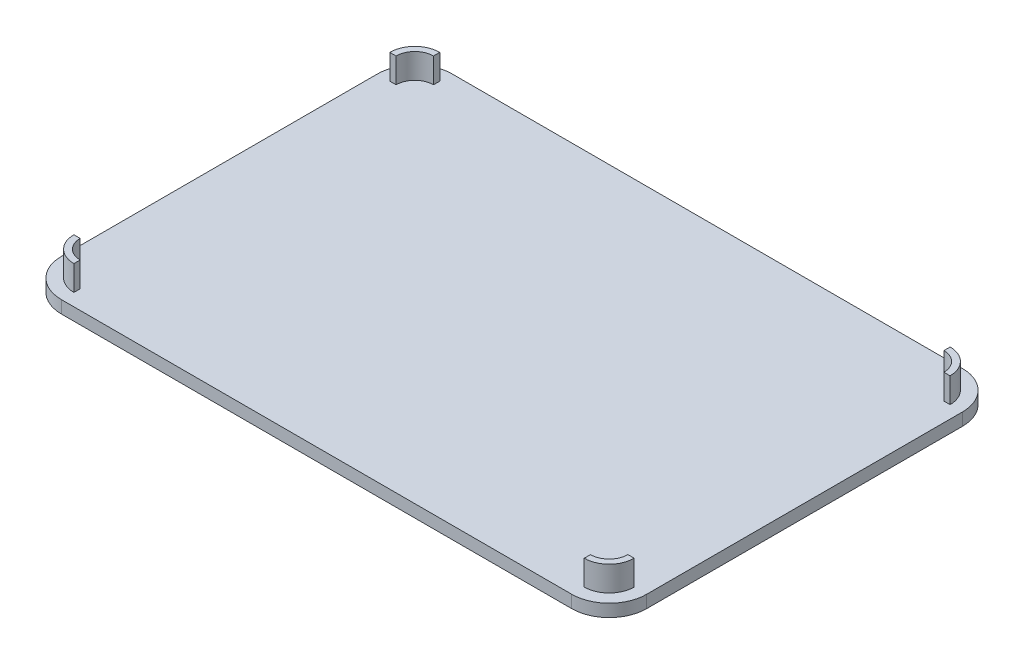
ISO-10303-21;
HEADER;
FILE_DESCRIPTION(('STEP AP214'),'2;1');
FILE_NAME('part.step','',(''),(''),'','','');
FILE_SCHEMA(('AUTOMOTIVE_DESIGN { 1 0 10303 214 1 1 1 1 }'));
ENDSEC;
DATA;
#1=APPLICATION_CONTEXT('core data for automotive mechanical design processes');
#2=APPLICATION_PROTOCOL_DEFINITION('international standard','automotive_design',2000,#1);
#3=PRODUCT_CONTEXT('',#1,'mechanical');
#4=PRODUCT('Part','Part','',(#3));
#5=PRODUCT_RELATED_PRODUCT_CATEGORY('part','',(#4));
#6=PRODUCT_DEFINITION_FORMATION('','',#4);
#7=PRODUCT_DEFINITION_CONTEXT('part definition',#1,'design');
#8=PRODUCT_DEFINITION('design','',#6,#7);
#9=PRODUCT_DEFINITION_SHAPE('','',#8);
#10=(LENGTH_UNIT() NAMED_UNIT(*) SI_UNIT(.MILLI.,.METRE.));
#11=(NAMED_UNIT(*) PLANE_ANGLE_UNIT() SI_UNIT($,.RADIAN.));
#12=(NAMED_UNIT(*) SI_UNIT($,.STERADIAN.) SOLID_ANGLE_UNIT());
#13=UNCERTAINTY_MEASURE_WITH_UNIT(LENGTH_MEASURE(1.E-05),#10,'distance_accuracy_value','');
#14=(GEOMETRIC_REPRESENTATION_CONTEXT(3) GLOBAL_UNCERTAINTY_ASSIGNED_CONTEXT((#13)) GLOBAL_UNIT_ASSIGNED_CONTEXT((#10,
#11,#12)) REPRESENTATION_CONTEXT('',''));
#15=CARTESIAN_POINT('',(0.,0.,0.));
#16=DIRECTION('',(0.,0.,1.));
#17=DIRECTION('',(1.,0.,0.));
#18=AXIS2_PLACEMENT_3D('',#15,#16,#17);
#19=CARTESIAN_POINT('',(40.87,2.,25.3));
#20=DIRECTION('',(0.,-1.,0.));
#21=DIRECTION('',(0.,0.,-1.));
#22=AXIS2_PLACEMENT_3D('',#19,#20,#21);
#23=CYLINDRICAL_SURFACE('',#22,6.);
#24=CARTESIAN_POINT('',(40.87,0.,25.3));
#25=DIRECTION('',(0.,1.,0.));
#26=DIRECTION('',(0.,0.,1.));
#27=AXIS2_PLACEMENT_3D('',#24,#25,#26);
#28=CIRCLE('',#27,6.);
#29=CARTESIAN_POINT('',(40.87,0.,31.3));
#30=VERTEX_POINT('',#29);
#31=CARTESIAN_POINT('',(46.87,0.,25.3));
#32=VERTEX_POINT('',#31);
#33=EDGE_CURVE('E318',#30,#32,#28,.T.);
#34=ORIENTED_EDGE('',*,*,#33,.T.);
#35=DIRECTION('',(0.,-1.,0.));
#36=VECTOR('',#35,1.);
#37=CARTESIAN_POINT('',(46.87,2.,25.3));
#38=LINE('',#37,#36);
#39=CARTESIAN_POINT('',(46.87,2.,25.3));
#40=VERTEX_POINT('',#39);
#41=EDGE_CURVE('E11',#40,#32,#38,.T.);
#42=ORIENTED_EDGE('',*,*,#41,.F.);
#43=CARTESIAN_POINT('',(40.87,2.,25.3));
#44=DIRECTION('',(0.,1.,0.));
#45=DIRECTION('',(0.,0.,1.));
#46=AXIS2_PLACEMENT_3D('',#43,#44,#45);
#47=CIRCLE('',#46,6.);
#48=CARTESIAN_POINT('',(40.87,2.,31.3));
#49=VERTEX_POINT('',#48);
#50=EDGE_CURVE('E319',#49,#40,#47,.T.);
#51=ORIENTED_EDGE('',*,*,#50,.F.);
#52=DIRECTION('',(0.,-1.,0.));
#53=VECTOR('',#52,1.);
#54=CARTESIAN_POINT('',(40.87,2.,31.3));
#55=LINE('',#54,#53);
#56=EDGE_CURVE('E337',#49,#30,#55,.T.);
#57=ORIENTED_EDGE('',*,*,#56,.T.);
#58=EDGE_LOOP('',(#34,#42,#51,#57));
#59=FACE_BOUND('',#58,.T.);
#60=ADVANCED_FACE('F35',(#59),#23,.T.);
#61=CARTESIAN_POINT('',(46.87,2.,25.3));
#62=DIRECTION('',(-1.,0.,0.));
#63=DIRECTION('',(0.,0.,1.));
#64=AXIS2_PLACEMENT_3D('',#61,#62,#63);
#65=PLANE('',#64);
#66=DIRECTION('',(0.,0.,-1.));
#67=VECTOR('',#66,1.);
#68=CARTESIAN_POINT('',(46.87,0.,25.3));
#69=LINE('',#68,#67);
#70=CARTESIAN_POINT('',(46.87,0.,-25.3));
#71=VERTEX_POINT('',#70);
#72=EDGE_CURVE('E340',#32,#71,#69,.T.);
#73=ORIENTED_EDGE('',*,*,#72,.T.);
#74=DIRECTION('',(0.,-1.,0.));
#75=VECTOR('',#74,1.);
#76=CARTESIAN_POINT('',(46.87,2.,-25.3));
#77=LINE('',#76,#75);
#78=CARTESIAN_POINT('',(46.87,2.,-25.3));
#79=VERTEX_POINT('',#78);
#80=EDGE_CURVE('E42',#79,#71,#77,.T.);
#81=ORIENTED_EDGE('',*,*,#80,.F.);
#82=DIRECTION('',(0.,0.,-1.));
#83=VECTOR('',#82,1.);
#84=CARTESIAN_POINT('',(46.87,2.,25.3));
#85=LINE('',#84,#83);
#86=EDGE_CURVE('E322',#40,#79,#85,.T.);
#87=ORIENTED_EDGE('',*,*,#86,.F.);
#88=ORIENTED_EDGE('',*,*,#41,.T.);
#89=EDGE_LOOP('',(#73,#81,#87,#88));
#90=FACE_BOUND('',#89,.T.);
#91=ADVANCED_FACE('F396',(#90),#65,.F.);
#92=CARTESIAN_POINT('',(40.87,2.,-25.3));
#93=DIRECTION('',(0.,-1.,0.));
#94=DIRECTION('',(0.,0.,-1.));
#95=AXIS2_PLACEMENT_3D('',#92,#93,#94);
#96=CYLINDRICAL_SURFACE('',#95,6.);
#97=CARTESIAN_POINT('',(40.87,0.,-25.3));
#98=DIRECTION('',(0.,1.,0.));
#99=DIRECTION('',(0.,0.,-1.));
#100=AXIS2_PLACEMENT_3D('',#97,#98,#99);
#101=CIRCLE('',#100,6.);
#102=CARTESIAN_POINT('',(40.87,0.,-31.3));
#103=VERTEX_POINT('',#102);
#104=EDGE_CURVE('E342',#71,#103,#101,.T.);
#105=ORIENTED_EDGE('',*,*,#104,.T.);
#106=DIRECTION('',(0.,-1.,0.));
#107=VECTOR('',#106,1.);
#108=CARTESIAN_POINT('',(40.87,2.,-31.3));
#109=LINE('',#108,#107);
#110=CARTESIAN_POINT('',(40.87,2.,-31.3));
#111=VERTEX_POINT('',#110);
#112=EDGE_CURVE('E367',#111,#103,#109,.T.);
#113=ORIENTED_EDGE('',*,*,#112,.F.);
#114=CARTESIAN_POINT('',(40.87,2.,-25.3));
#115=DIRECTION('',(0.,1.,0.));
#116=DIRECTION('',(0.,0.,-1.));
#117=AXIS2_PLACEMENT_3D('',#114,#115,#116);
#118=CIRCLE('',#117,6.);
#119=EDGE_CURVE('E325',#79,#111,#118,.T.);
#120=ORIENTED_EDGE('',*,*,#119,.F.);
#121=ORIENTED_EDGE('',*,*,#80,.T.);
#122=EDGE_LOOP('',(#105,#113,#120,#121));
#123=FACE_BOUND('',#122,.T.);
#124=ADVANCED_FACE('F374',(#123),#96,.T.);
#125=CARTESIAN_POINT('',(-40.8699999999999,2.,-31.3));
#126=DIRECTION('',(0.,0.,1.));
#127=DIRECTION('',(1.,0.,0.));
#128=AXIS2_PLACEMENT_3D('',#125,#126,#127);
#129=PLANE('',#128);
#130=DIRECTION('',(-1.,0.,0.));
#131=VECTOR('',#130,1.);
#132=CARTESIAN_POINT('',(-40.8699999999999,0.,-31.3));
#133=LINE('',#132,#131);
#134=CARTESIAN_POINT('',(-40.87,0.,-31.3));
#135=VERTEX_POINT('',#134);
#136=EDGE_CURVE('E344',#103,#135,#133,.T.);
#137=ORIENTED_EDGE('',*,*,#136,.T.);
#138=DIRECTION('',(0.,-1.,0.));
#139=VECTOR('',#138,1.);
#140=CARTESIAN_POINT('',(-40.87,2.,-31.3));
#141=LINE('',#140,#139);
#142=CARTESIAN_POINT('',(-40.87,2.,-31.3));
#143=VERTEX_POINT('',#142);
#144=EDGE_CURVE('E364',#143,#135,#141,.T.);
#145=ORIENTED_EDGE('',*,*,#144,.F.);
#146=DIRECTION('',(-1.,0.,0.));
#147=VECTOR('',#146,1.);
#148=CARTESIAN_POINT('',(-40.8699999999999,2.,-31.3));
#149=LINE('',#148,#147);
#150=EDGE_CURVE('E327',#111,#143,#149,.T.);
#151=ORIENTED_EDGE('',*,*,#150,.F.);
#152=ORIENTED_EDGE('',*,*,#112,.T.);
#153=EDGE_LOOP('',(#137,#145,#151,#152));
#154=FACE_BOUND('',#153,.T.);
#155=ADVANCED_FACE('F385',(#154),#129,.F.);
#156=CARTESIAN_POINT('',(-40.87,2.,-25.3));
#157=DIRECTION('',(0.,-1.,0.));
#158=DIRECTION('',(0.,0.,-1.));
#159=AXIS2_PLACEMENT_3D('',#156,#157,#158);
#160=CYLINDRICAL_SURFACE('',#159,6.);
#161=CARTESIAN_POINT('',(-40.87,0.,-25.3));
#162=DIRECTION('',(0.,1.,0.));
#163=DIRECTION('',(0.,0.,-1.));
#164=AXIS2_PLACEMENT_3D('',#161,#162,#163);
#165=CIRCLE('',#164,6.);
#166=CARTESIAN_POINT('',(-46.87,0.,-25.3));
#167=VERTEX_POINT('',#166);
#168=EDGE_CURVE('E346',#135,#167,#165,.T.);
#169=ORIENTED_EDGE('',*,*,#168,.T.);
#170=DIRECTION('',(0.,-1.,0.));
#171=VECTOR('',#170,1.);
#172=CARTESIAN_POINT('',(-46.87,2.,-25.3));
#173=LINE('',#172,#171);
#174=CARTESIAN_POINT('',(-46.87,2.,-25.3));
#175=VERTEX_POINT('',#174);
#176=EDGE_CURVE('E361',#175,#167,#173,.T.);
#177=ORIENTED_EDGE('',*,*,#176,.F.);
#178=CARTESIAN_POINT('',(-40.87,2.,-25.3));
#179=DIRECTION('',(0.,1.,0.));
#180=DIRECTION('',(0.,0.,-1.));
#181=AXIS2_PLACEMENT_3D('',#178,#179,#180);
#182=CIRCLE('',#181,6.);
#183=EDGE_CURVE('E329',#143,#175,#182,.T.);
#184=ORIENTED_EDGE('',*,*,#183,.F.);
#185=ORIENTED_EDGE('',*,*,#144,.T.);
#186=EDGE_LOOP('',(#169,#177,#184,#185));
#187=FACE_BOUND('',#186,.T.);
#188=ADVANCED_FACE('F389',(#187),#160,.T.);
#189=CARTESIAN_POINT('',(-46.87,2.,25.3));
#190=DIRECTION('',(1.,0.,0.));
#191=DIRECTION('',(0.,0.,-1.));
#192=AXIS2_PLACEMENT_3D('',#189,#190,#191);
#193=PLANE('',#192);
#194=DIRECTION('',(0.,0.,1.));
#195=VECTOR('',#194,1.);
#196=CARTESIAN_POINT('',(-46.87,0.,25.3));
#197=LINE('',#196,#195);
#198=CARTESIAN_POINT('',(-46.87,0.,25.3));
#199=VERTEX_POINT('',#198);
#200=EDGE_CURVE('E348',#167,#199,#197,.T.);
#201=ORIENTED_EDGE('',*,*,#200,.T.);
#202=DIRECTION('',(0.,-1.,0.));
#203=VECTOR('',#202,1.);
#204=CARTESIAN_POINT('',(-46.87,2.,25.3));
#205=LINE('',#204,#203);
#206=CARTESIAN_POINT('',(-46.87,2.,25.3));
#207=VERTEX_POINT('',#206);
#208=EDGE_CURVE('E358',#207,#199,#205,.T.);
#209=ORIENTED_EDGE('',*,*,#208,.F.);
#210=DIRECTION('',(0.,0.,1.));
#211=VECTOR('',#210,1.);
#212=CARTESIAN_POINT('',(-46.87,2.,25.3));
#213=LINE('',#212,#211);
#214=EDGE_CURVE('E331',#175,#207,#213,.T.);
#215=ORIENTED_EDGE('',*,*,#214,.F.);
#216=ORIENTED_EDGE('',*,*,#176,.T.);
#217=EDGE_LOOP('',(#201,#209,#215,#216));
#218=FACE_BOUND('',#217,.T.);
#219=ADVANCED_FACE('F409',(#218),#193,.F.);
#220=CARTESIAN_POINT('',(-40.87,2.,25.3));
#221=DIRECTION('',(0.,-1.,0.));
#222=DIRECTION('',(0.,0.,-1.));
#223=AXIS2_PLACEMENT_3D('',#220,#221,#222);
#224=CYLINDRICAL_SURFACE('',#223,6.);
#225=CARTESIAN_POINT('',(-40.87,0.,25.3));
#226=DIRECTION('',(0.,1.,0.));
#227=DIRECTION('',(0.,0.,-1.));
#228=AXIS2_PLACEMENT_3D('',#225,#226,#227);
#229=CIRCLE('',#228,6.);
#230=CARTESIAN_POINT('',(-40.8699999999999,0.,31.3));
#231=VERTEX_POINT('',#230);
#232=EDGE_CURVE('E350',#199,#231,#229,.T.);
#233=ORIENTED_EDGE('',*,*,#232,.T.);
#234=DIRECTION('',(0.,-1.,0.));
#235=VECTOR('',#234,1.);
#236=CARTESIAN_POINT('',(-40.8699999999999,2.,31.3));
#237=LINE('',#236,#235);
#238=CARTESIAN_POINT('',(-40.8699999999999,2.,31.3));
#239=VERTEX_POINT('',#238);
#240=EDGE_CURVE('E355',#239,#231,#237,.T.);
#241=ORIENTED_EDGE('',*,*,#240,.F.);
#242=CARTESIAN_POINT('',(-40.87,2.,25.3));
#243=DIRECTION('',(0.,1.,0.));
#244=DIRECTION('',(0.,0.,-1.));
#245=AXIS2_PLACEMENT_3D('',#242,#243,#244);
#246=CIRCLE('',#245,6.);
#247=EDGE_CURVE('E333',#207,#239,#246,.T.);
#248=ORIENTED_EDGE('',*,*,#247,.F.);
#249=ORIENTED_EDGE('',*,*,#208,.T.);
#250=EDGE_LOOP('',(#233,#241,#248,#249));
#251=FACE_BOUND('',#250,.T.);
#252=ADVANCED_FACE('F407',(#251),#224,.T.);
#253=CARTESIAN_POINT('',(-40.8699999999999,2.,31.3));
#254=DIRECTION('',(0.,0.,-1.));
#255=DIRECTION('',(-1.,0.,0.));
#256=AXIS2_PLACEMENT_3D('',#253,#254,#255);
#257=PLANE('',#256);
#258=DIRECTION('',(1.,0.,0.));
#259=VECTOR('',#258,1.);
#260=CARTESIAN_POINT('',(-40.8699999999999,0.,31.3));
#261=LINE('',#260,#259);
#262=EDGE_CURVE('E323',#231,#30,#261,.T.);
#263=ORIENTED_EDGE('',*,*,#262,.T.);
#264=ORIENTED_EDGE('',*,*,#56,.F.);
#265=DIRECTION('',(1.,0.,0.));
#266=VECTOR('',#265,1.);
#267=CARTESIAN_POINT('',(-40.8699999999999,2.,31.3));
#268=LINE('',#267,#266);
#269=EDGE_CURVE('E335',#239,#49,#268,.T.);
#270=ORIENTED_EDGE('',*,*,#269,.F.);
#271=ORIENTED_EDGE('',*,*,#240,.T.);
#272=EDGE_LOOP('',(#263,#264,#270,#271));
#273=FACE_BOUND('',#272,.T.);
#274=ADVANCED_FACE('F402',(#273),#257,.F.);
#275=CARTESIAN_POINT('',(40.87,2.,25.3));
#276=DIRECTION('',(0.,1.,0.));
#277=DIRECTION('',(0.,0.,1.));
#278=AXIS2_PLACEMENT_3D('',#275,#276,#277);
#279=PLANE('',#278);
#280=DIRECTION('',(1.,0.,0.));
#281=VECTOR('',#280,1.);
#282=CARTESIAN_POINT('',(43.87,2.,25.3));
#283=LINE('',#282,#281);
#284=CARTESIAN_POINT('',(43.87,2.,25.3));
#285=VERTEX_POINT('',#284);
#286=CARTESIAN_POINT('',(44.87,2.,25.3));
#287=VERTEX_POINT('',#286);
#288=EDGE_CURVE('E192',#285,#287,#283,.T.);
#289=ORIENTED_EDGE('',*,*,#288,.T.);
#290=CARTESIAN_POINT('',(40.87,2.,25.3));
#291=DIRECTION('',(0.,-1.,0.));
#292=DIRECTION('',(0.,0.,-1.));
#293=AXIS2_PLACEMENT_3D('',#290,#291,#292);
#294=CIRCLE('',#293,4.);
#295=CARTESIAN_POINT('',(40.87,2.,29.3));
#296=VERTEX_POINT('',#295);
#297=EDGE_CURVE('E197',#287,#296,#294,.T.);
#298=ORIENTED_EDGE('',*,*,#297,.T.);
#299=DIRECTION('',(0.,0.,-1.));
#300=VECTOR('',#299,1.);
#301=CARTESIAN_POINT('',(40.87,2.,29.3));
#302=LINE('',#301,#300);
#303=CARTESIAN_POINT('',(40.87,2.,28.3));
#304=VERTEX_POINT('',#303);
#305=EDGE_CURVE('E54',#296,#304,#302,.T.);
#306=ORIENTED_EDGE('',*,*,#305,.T.);
#307=CARTESIAN_POINT('',(40.87,2.,25.3));
#308=DIRECTION('',(0.,-1.,0.));
#309=DIRECTION('',(0.,0.,-1.));
#310=AXIS2_PLACEMENT_3D('',#307,#308,#309);
#311=CIRCLE('',#310,3.);
#312=EDGE_CURVE('E49',#285,#304,#311,.T.);
#313=ORIENTED_EDGE('',*,*,#312,.F.);
#314=EDGE_LOOP('',(#289,#298,#306,#313));
#315=FACE_BOUND('',#314,.T.);
#316=CARTESIAN_POINT('',(-40.87,2.,25.3));
#317=DIRECTION('',(0.,1.,0.));
#318=DIRECTION('',(0.,0.,1.));
#319=AXIS2_PLACEMENT_3D('',#316,#317,#318);
#320=CIRCLE('',#319,4.);
#321=CARTESIAN_POINT('',(-44.87,2.,25.3));
#322=VERTEX_POINT('',#321);
#323=CARTESIAN_POINT('',(-40.87,2.,29.3));
#324=VERTEX_POINT('',#323);
#325=EDGE_CURVE('E243',#322,#324,#320,.T.);
#326=ORIENTED_EDGE('',*,*,#325,.F.);
#327=DIRECTION('',(-1.,0.,0.));
#328=VECTOR('',#327,1.);
#329=CARTESIAN_POINT('',(-43.87,2.,25.3));
#330=LINE('',#329,#328);
#331=CARTESIAN_POINT('',(-43.87,2.,25.3));
#332=VERTEX_POINT('',#331);
#333=EDGE_CURVE('E246',#332,#322,#330,.T.);
#334=ORIENTED_EDGE('',*,*,#333,.F.);
#335=CARTESIAN_POINT('',(-40.87,2.,25.3));
#336=DIRECTION('',(0.,1.,0.));
#337=DIRECTION('',(0.,0.,1.));
#338=AXIS2_PLACEMENT_3D('',#335,#336,#337);
#339=CIRCLE('',#338,3.);
#340=CARTESIAN_POINT('',(-40.87,2.,28.3));
#341=VERTEX_POINT('',#340);
#342=EDGE_CURVE('E237',#332,#341,#339,.T.);
#343=ORIENTED_EDGE('',*,*,#342,.T.);
#344=DIRECTION('',(0.,0.,-1.));
#345=VECTOR('',#344,1.);
#346=CARTESIAN_POINT('',(-40.87,2.,29.3));
#347=LINE('',#346,#345);
#348=EDGE_CURVE('E239',#324,#341,#347,.T.);
#349=ORIENTED_EDGE('',*,*,#348,.F.);
#350=EDGE_LOOP('',(#326,#334,#343,#349));
#351=FACE_BOUND('',#350,.T.);
#352=CARTESIAN_POINT('',(-40.87,2.,-25.3));
#353=DIRECTION('',(0.,1.,0.));
#354=DIRECTION('',(0.,0.,1.));
#355=AXIS2_PLACEMENT_3D('',#352,#353,#354);
#356=CIRCLE('',#355,4.);
#357=CARTESIAN_POINT('',(-44.87,2.,-25.3));
#358=VERTEX_POINT('',#357);
#359=CARTESIAN_POINT('',(-40.87,2.,-29.3));
#360=VERTEX_POINT('',#359);
#361=EDGE_CURVE('E278',#358,#360,#356,.F.);
#362=ORIENTED_EDGE('',*,*,#361,.T.);
#363=DIRECTION('',(0.,0.,1.));
#364=VECTOR('',#363,1.);
#365=CARTESIAN_POINT('',(-40.87,2.,0.));
#366=LINE('',#365,#364);
#367=CARTESIAN_POINT('',(-40.87,2.,-28.3));
#368=VERTEX_POINT('',#367);
#369=EDGE_CURVE('E270',#360,#368,#366,.T.);
#370=ORIENTED_EDGE('',*,*,#369,.T.);
#371=CARTESIAN_POINT('',(-40.87,2.,-25.3));
#372=DIRECTION('',(0.,1.,0.));
#373=DIRECTION('',(0.,0.,1.));
#374=AXIS2_PLACEMENT_3D('',#371,#372,#373);
#375=CIRCLE('',#374,3.);
#376=CARTESIAN_POINT('',(-43.87,2.,-25.3));
#377=VERTEX_POINT('',#376);
#378=EDGE_CURVE('E272',#377,#368,#375,.F.);
#379=ORIENTED_EDGE('',*,*,#378,.F.);
#380=DIRECTION('',(-1.,0.,0.));
#381=VECTOR('',#380,1.);
#382=CARTESIAN_POINT('',(0.,2.,-25.3));
#383=LINE('',#382,#381);
#384=EDGE_CURVE('E276',#377,#358,#383,.T.);
#385=ORIENTED_EDGE('',*,*,#384,.T.);
#386=EDGE_LOOP('',(#362,#370,#379,#385));
#387=FACE_BOUND('',#386,.T.);
#388=CARTESIAN_POINT('',(40.87,2.,-25.3));
#389=DIRECTION('',(0.,1.,0.));
#390=DIRECTION('',(0.,0.,1.));
#391=AXIS2_PLACEMENT_3D('',#388,#389,#390);
#392=CIRCLE('',#391,3.);
#393=CARTESIAN_POINT('',(43.87,2.,-25.3));
#394=VERTEX_POINT('',#393);
#395=CARTESIAN_POINT('',(40.87,2.,-28.3));
#396=VERTEX_POINT('',#395);
#397=EDGE_CURVE('E280',#394,#396,#392,.T.);
#398=ORIENTED_EDGE('',*,*,#397,.T.);
#399=DIRECTION('',(0.,0.,1.));
#400=VECTOR('',#399,1.);
#401=CARTESIAN_POINT('',(40.87,2.,0.));
#402=LINE('',#401,#400);
#403=CARTESIAN_POINT('',(40.87,2.,-29.3));
#404=VERTEX_POINT('',#403);
#405=EDGE_CURVE('E294',#404,#396,#402,.T.);
#406=ORIENTED_EDGE('',*,*,#405,.F.);
#407=CARTESIAN_POINT('',(40.87,2.,-25.3));
#408=DIRECTION('',(0.,1.,0.));
#409=DIRECTION('',(0.,0.,1.));
#410=AXIS2_PLACEMENT_3D('',#407,#408,#409);
#411=CIRCLE('',#410,4.);
#412=CARTESIAN_POINT('',(44.87,2.,-25.3));
#413=VERTEX_POINT('',#412);
#414=EDGE_CURVE('E305',#413,#404,#411,.T.);
#415=ORIENTED_EDGE('',*,*,#414,.F.);
#416=DIRECTION('',(1.,0.,0.));
#417=VECTOR('',#416,1.);
#418=CARTESIAN_POINT('',(0.,2.,-25.3));
#419=LINE('',#418,#417);
#420=EDGE_CURVE('E303',#394,#413,#419,.T.);
#421=ORIENTED_EDGE('',*,*,#420,.F.);
#422=EDGE_LOOP('',(#398,#406,#415,#421));
#423=FACE_BOUND('',#422,.T.);
#424=ORIENTED_EDGE('',*,*,#50,.T.);
#425=ORIENTED_EDGE('',*,*,#86,.T.);
#426=ORIENTED_EDGE('',*,*,#119,.T.);
#427=ORIENTED_EDGE('',*,*,#150,.T.);
#428=ORIENTED_EDGE('',*,*,#183,.T.);
#429=ORIENTED_EDGE('',*,*,#214,.T.);
#430=ORIENTED_EDGE('',*,*,#247,.T.);
#431=ORIENTED_EDGE('',*,*,#269,.T.);
#432=EDGE_LOOP('',(#424,#425,#426,#427,#428,#429,#430,#431));
#433=FACE_BOUND('',#432,.T.);
#434=ADVANCED_FACE('F194',(#315,#351,#387,#423,#433),#279,.T.);
#435=CARTESIAN_POINT('',(40.87,0.,25.3));
#436=DIRECTION('',(0.,1.,0.));
#437=DIRECTION('',(0.,0.,1.));
#438=AXIS2_PLACEMENT_3D('',#435,#436,#437);
#439=PLANE('',#438);
#440=ORIENTED_EDGE('',*,*,#33,.F.);
#441=ORIENTED_EDGE('',*,*,#262,.F.);
#442=ORIENTED_EDGE('',*,*,#232,.F.);
#443=ORIENTED_EDGE('',*,*,#200,.F.);
#444=ORIENTED_EDGE('',*,*,#168,.F.);
#445=ORIENTED_EDGE('',*,*,#136,.F.);
#446=ORIENTED_EDGE('',*,*,#104,.F.);
#447=ORIENTED_EDGE('',*,*,#72,.F.);
#448=EDGE_LOOP('',(#440,#441,#442,#443,#444,#445,#446,#447));
#449=FACE_BOUND('',#448,.T.);
#450=ADVANCED_FACE('F380',(#449),#439,.F.);
#451=CARTESIAN_POINT('',(40.87,6.,-25.3));
#452=DIRECTION('',(0.,-1.,0.));
#453=DIRECTION('',(0.,0.,-1.));
#454=AXIS2_PLACEMENT_3D('',#451,#452,#453);
#455=CYLINDRICAL_SURFACE('',#454,3.);
#456=ORIENTED_EDGE('',*,*,#397,.F.);
#457=DIRECTION('',(0.,-1.,0.));
#458=VECTOR('',#457,1.);
#459=CARTESIAN_POINT('',(43.87,6.,-25.3));
#460=LINE('',#459,#458);
#461=CARTESIAN_POINT('',(43.87,6.,-25.3));
#462=VERTEX_POINT('',#461);
#463=EDGE_CURVE('E316',#462,#394,#460,.T.);
#464=ORIENTED_EDGE('',*,*,#463,.F.);
#465=CARTESIAN_POINT('',(40.87,6.,-25.3));
#466=DIRECTION('',(0.,1.,0.));
#467=DIRECTION('',(0.,0.,1.));
#468=AXIS2_PLACEMENT_3D('',#465,#466,#467);
#469=CIRCLE('',#468,3.);
#470=CARTESIAN_POINT('',(40.87,6.,-28.3));
#471=VERTEX_POINT('',#470);
#472=EDGE_CURVE('E290',#462,#471,#469,.T.);
#473=ORIENTED_EDGE('',*,*,#472,.T.);
#474=DIRECTION('',(0.,-1.,0.));
#475=VECTOR('',#474,1.);
#476=CARTESIAN_POINT('',(40.87,6.,-28.3));
#477=LINE('',#476,#475);
#478=EDGE_CURVE('E300',#471,#396,#477,.T.);
#479=ORIENTED_EDGE('',*,*,#478,.T.);
#480=EDGE_LOOP('',(#456,#464,#473,#479));
#481=FACE_BOUND('',#480,.T.);
#482=ADVANCED_FACE('F465',(#481),#455,.F.);
#483=CARTESIAN_POINT('',(0.,6.,-25.3));
#484=DIRECTION('',(0.,0.,-1.));
#485=DIRECTION('',(-1.,0.,0.));
#486=AXIS2_PLACEMENT_3D('',#483,#484,#485);
#487=PLANE('',#486);
#488=ORIENTED_EDGE('',*,*,#420,.T.);
#489=DIRECTION('',(0.,-1.,0.));
#490=VECTOR('',#489,1.);
#491=CARTESIAN_POINT('',(44.87,6.,-25.3));
#492=LINE('',#491,#490);
#493=CARTESIAN_POINT('',(44.87,6.,-25.3));
#494=VERTEX_POINT('',#493);
#495=EDGE_CURVE('E313',#494,#413,#492,.T.);
#496=ORIENTED_EDGE('',*,*,#495,.F.);
#497=DIRECTION('',(1.,0.,0.));
#498=VECTOR('',#497,1.);
#499=CARTESIAN_POINT('',(0.,6.,-25.3));
#500=LINE('',#499,#498);
#501=EDGE_CURVE('E293',#462,#494,#500,.T.);
#502=ORIENTED_EDGE('',*,*,#501,.F.);
#503=ORIENTED_EDGE('',*,*,#463,.T.);
#504=EDGE_LOOP('',(#488,#496,#502,#503));
#505=FACE_BOUND('',#504,.T.);
#506=ADVANCED_FACE('F480',(#505),#487,.F.);
#507=CARTESIAN_POINT('',(40.87,6.,-25.3));
#508=DIRECTION('',(0.,-1.,0.));
#509=DIRECTION('',(0.,0.,-1.));
#510=AXIS2_PLACEMENT_3D('',#507,#508,#509);
#511=CYLINDRICAL_SURFACE('',#510,4.);
#512=ORIENTED_EDGE('',*,*,#414,.T.);
#513=DIRECTION('',(0.,-1.,0.));
#514=VECTOR('',#513,1.);
#515=CARTESIAN_POINT('',(40.87,6.,-29.3));
#516=LINE('',#515,#514);
#517=CARTESIAN_POINT('',(40.87,6.,-29.3));
#518=VERTEX_POINT('',#517);
#519=EDGE_CURVE('E311',#518,#404,#516,.T.);
#520=ORIENTED_EDGE('',*,*,#519,.F.);
#521=CARTESIAN_POINT('',(40.87,6.,-25.3));
#522=DIRECTION('',(0.,1.,0.));
#523=DIRECTION('',(0.,0.,1.));
#524=AXIS2_PLACEMENT_3D('',#521,#522,#523);
#525=CIRCLE('',#524,4.);
#526=EDGE_CURVE('E296',#494,#518,#525,.T.);
#527=ORIENTED_EDGE('',*,*,#526,.F.);
#528=ORIENTED_EDGE('',*,*,#495,.T.);
#529=EDGE_LOOP('',(#512,#520,#527,#528));
#530=FACE_BOUND('',#529,.T.);
#531=ADVANCED_FACE('F490',(#530),#511,.T.);
#532=CARTESIAN_POINT('',(40.87,6.,0.));
#533=DIRECTION('',(1.,0.,0.));
#534=DIRECTION('',(0.,0.,-1.));
#535=AXIS2_PLACEMENT_3D('',#532,#533,#534);
#536=PLANE('',#535);
#537=ORIENTED_EDGE('',*,*,#405,.T.);
#538=ORIENTED_EDGE('',*,*,#478,.F.);
#539=DIRECTION('',(0.,0.,1.));
#540=VECTOR('',#539,1.);
#541=CARTESIAN_POINT('',(40.87,6.,0.));
#542=LINE('',#541,#540);
#543=EDGE_CURVE('E298',#518,#471,#542,.T.);
#544=ORIENTED_EDGE('',*,*,#543,.F.);
#545=ORIENTED_EDGE('',*,*,#519,.T.);
#546=EDGE_LOOP('',(#537,#538,#544,#545));
#547=FACE_BOUND('',#546,.T.);
#548=ADVANCED_FACE('F500',(#547),#536,.F.);
#549=CARTESIAN_POINT('',(0.,6.,0.));
#550=DIRECTION('',(0.,1.,0.));
#551=DIRECTION('',(0.,0.,1.));
#552=AXIS2_PLACEMENT_3D('',#549,#550,#551);
#553=PLANE('',#552);
#554=ORIENTED_EDGE('',*,*,#472,.F.);
#555=ORIENTED_EDGE('',*,*,#501,.T.);
#556=ORIENTED_EDGE('',*,*,#526,.T.);
#557=ORIENTED_EDGE('',*,*,#543,.T.);
#558=EDGE_LOOP('',(#554,#555,#556,#557));
#559=FACE_BOUND('',#558,.T.);
#560=ADVANCED_FACE('F510',(#559),#553,.T.);
#561=CARTESIAN_POINT('',(-40.87,6.,-25.3));
#562=DIRECTION('',(0.,-1.,0.));
#563=DIRECTION('',(0.,0.,-1.));
#564=AXIS2_PLACEMENT_3D('',#561,#562,#563);
#565=CYLINDRICAL_SURFACE('',#564,4.);
#566=ORIENTED_EDGE('',*,*,#361,.F.);
#567=DIRECTION('',(0.,-1.,0.));
#568=VECTOR('',#567,1.);
#569=CARTESIAN_POINT('',(-44.87,6.,-25.3));
#570=LINE('',#569,#568);
#571=CARTESIAN_POINT('',(-44.87,6.,-25.3));
#572=VERTEX_POINT('',#571);
#573=EDGE_CURVE('E249',#572,#358,#570,.T.);
#574=ORIENTED_EDGE('',*,*,#573,.F.);
#575=CARTESIAN_POINT('',(-40.87,6.,-25.3));
#576=DIRECTION('',(0.,1.,0.));
#577=DIRECTION('',(0.,0.,1.));
#578=AXIS2_PLACEMENT_3D('',#575,#576,#577);
#579=CIRCLE('',#578,4.);
#580=CARTESIAN_POINT('',(-40.87,6.,-29.3));
#581=VERTEX_POINT('',#580);
#582=EDGE_CURVE('E273',#572,#581,#579,.F.);
#583=ORIENTED_EDGE('',*,*,#582,.T.);
#584=DIRECTION('',(0.,-1.,0.));
#585=VECTOR('',#584,1.);
#586=CARTESIAN_POINT('',(-40.87,6.,-29.3));
#587=LINE('',#586,#585);
#588=EDGE_CURVE('E266',#581,#360,#587,.T.);
#589=ORIENTED_EDGE('',*,*,#588,.T.);
#590=EDGE_LOOP('',(#566,#574,#583,#589));
#591=FACE_BOUND('',#590,.T.);
#592=ADVANCED_FACE('F520',(#591),#565,.T.);
#593=CARTESIAN_POINT('',(0.,6.,-25.3));
#594=DIRECTION('',(0.,0.,1.));
#595=DIRECTION('',(1.,0.,0.));
#596=AXIS2_PLACEMENT_3D('',#593,#594,#595);
#597=PLANE('',#596);
#598=ORIENTED_EDGE('',*,*,#384,.F.);
#599=DIRECTION('',(0.,-1.,0.));
#600=VECTOR('',#599,1.);
#601=CARTESIAN_POINT('',(-43.87,6.,-25.3));
#602=LINE('',#601,#600);
#603=CARTESIAN_POINT('',(-43.87,6.,-25.3));
#604=VERTEX_POINT('',#603);
#605=EDGE_CURVE('E260',#604,#377,#602,.T.);
#606=ORIENTED_EDGE('',*,*,#605,.F.);
#607=DIRECTION('',(-1.,0.,0.));
#608=VECTOR('',#607,1.);
#609=CARTESIAN_POINT('',(0.,6.,-25.3));
#610=LINE('',#609,#608);
#611=EDGE_CURVE('E285',#604,#572,#610,.T.);
#612=ORIENTED_EDGE('',*,*,#611,.T.);
#613=ORIENTED_EDGE('',*,*,#573,.T.);
#614=EDGE_LOOP('',(#598,#606,#612,#613));
#615=FACE_BOUND('',#614,.T.);
#616=ADVANCED_FACE('F530',(#615),#597,.T.);
#617=CARTESIAN_POINT('',(-40.87,6.,-25.3));
#618=DIRECTION('',(0.,-1.,0.));
#619=DIRECTION('',(0.,0.,-1.));
#620=AXIS2_PLACEMENT_3D('',#617,#618,#619);
#621=CYLINDRICAL_SURFACE('',#620,3.);
#622=ORIENTED_EDGE('',*,*,#378,.T.);
#623=DIRECTION('',(0.,-1.,0.));
#624=VECTOR('',#623,1.);
#625=CARTESIAN_POINT('',(-40.87,6.,-28.3));
#626=LINE('',#625,#624);
#627=CARTESIAN_POINT('',(-40.87,6.,-28.3));
#628=VERTEX_POINT('',#627);
#629=EDGE_CURVE('E263',#628,#368,#626,.T.);
#630=ORIENTED_EDGE('',*,*,#629,.F.);
#631=CARTESIAN_POINT('',(-40.87,6.,-25.3));
#632=DIRECTION('',(0.,1.,0.));
#633=DIRECTION('',(0.,0.,1.));
#634=AXIS2_PLACEMENT_3D('',#631,#632,#633);
#635=CIRCLE('',#634,3.);
#636=EDGE_CURVE('E283',#604,#628,#635,.F.);
#637=ORIENTED_EDGE('',*,*,#636,.F.);
#638=ORIENTED_EDGE('',*,*,#605,.T.);
#639=EDGE_LOOP('',(#622,#630,#637,#638));
#640=FACE_BOUND('',#639,.T.);
#641=ADVANCED_FACE('F540',(#640),#621,.F.);
#642=CARTESIAN_POINT('',(-40.87,6.,0.));
#643=DIRECTION('',(1.,0.,0.));
#644=DIRECTION('',(0.,0.,-1.));
#645=AXIS2_PLACEMENT_3D('',#642,#643,#644);
#646=PLANE('',#645);
#647=ORIENTED_EDGE('',*,*,#369,.F.);
#648=ORIENTED_EDGE('',*,*,#588,.F.);
#649=DIRECTION('',(0.,0.,1.));
#650=VECTOR('',#649,1.);
#651=CARTESIAN_POINT('',(-40.87,6.,0.));
#652=LINE('',#651,#650);
#653=EDGE_CURVE('E269',#581,#628,#652,.T.);
#654=ORIENTED_EDGE('',*,*,#653,.T.);
#655=ORIENTED_EDGE('',*,*,#629,.T.);
#656=EDGE_LOOP('',(#647,#648,#654,#655));
#657=FACE_BOUND('',#656,.T.);
#658=ADVANCED_FACE('F550',(#657),#646,.T.);
#659=CARTESIAN_POINT('',(0.,6.,0.));
#660=DIRECTION('',(0.,1.,0.));
#661=DIRECTION('',(0.,0.,1.));
#662=AXIS2_PLACEMENT_3D('',#659,#660,#661);
#663=PLANE('',#662);
#664=ORIENTED_EDGE('',*,*,#582,.F.);
#665=ORIENTED_EDGE('',*,*,#611,.F.);
#666=ORIENTED_EDGE('',*,*,#636,.T.);
#667=ORIENTED_EDGE('',*,*,#653,.F.);
#668=EDGE_LOOP('',(#664,#665,#666,#667));
#669=FACE_BOUND('',#668,.T.);
#670=ADVANCED_FACE('F560',(#669),#663,.T.);
#671=CARTESIAN_POINT('',(-43.87,6.,25.3));
#672=DIRECTION('',(0.,0.,1.));
#673=DIRECTION('',(1.,0.,0.));
#674=AXIS2_PLACEMENT_3D('',#671,#672,#673);
#675=PLANE('',#674);
#676=ORIENTED_EDGE('',*,*,#333,.T.);
#677=DIRECTION('',(0.,-1.,0.));
#678=VECTOR('',#677,1.);
#679=CARTESIAN_POINT('',(-44.87,6.,25.3));
#680=LINE('',#679,#678);
#681=CARTESIAN_POINT('',(-44.87,6.,25.3));
#682=VERTEX_POINT('',#681);
#683=EDGE_CURVE('E200',#682,#322,#680,.T.);
#684=ORIENTED_EDGE('',*,*,#683,.F.);
#685=DIRECTION('',(-1.,0.,0.));
#686=VECTOR('',#685,1.);
#687=CARTESIAN_POINT('',(-43.87,6.,25.3));
#688=LINE('',#687,#686);
#689=CARTESIAN_POINT('',(-43.87,6.,25.3));
#690=VERTEX_POINT('',#689);
#691=EDGE_CURVE('E240',#690,#682,#688,.T.);
#692=ORIENTED_EDGE('',*,*,#691,.F.);
#693=DIRECTION('',(0.,-1.,0.));
#694=VECTOR('',#693,1.);
#695=CARTESIAN_POINT('',(-43.87,6.,25.3));
#696=LINE('',#695,#694);
#697=EDGE_CURVE('E233',#690,#332,#696,.T.);
#698=ORIENTED_EDGE('',*,*,#697,.T.);
#699=EDGE_LOOP('',(#676,#684,#692,#698));
#700=FACE_BOUND('',#699,.T.);
#701=ADVANCED_FACE('F571',(#700),#675,.F.);
#702=CARTESIAN_POINT('',(-40.87,6.,25.3));
#703=DIRECTION('',(0.,-1.,0.));
#704=DIRECTION('',(0.,0.,-1.));
#705=AXIS2_PLACEMENT_3D('',#702,#703,#704);
#706=CYLINDRICAL_SURFACE('',#705,4.);
#707=ORIENTED_EDGE('',*,*,#325,.T.);
#708=DIRECTION('',(0.,-1.,0.));
#709=VECTOR('',#708,1.);
#710=CARTESIAN_POINT('',(-40.87,6.,29.3));
#711=LINE('',#710,#709);
#712=CARTESIAN_POINT('',(-40.87,6.,29.3));
#713=VERTEX_POINT('',#712);
#714=EDGE_CURVE('E227',#713,#324,#711,.T.);
#715=ORIENTED_EDGE('',*,*,#714,.F.);
#716=CARTESIAN_POINT('',(-40.87,6.,25.3));
#717=DIRECTION('',(0.,1.,0.));
#718=DIRECTION('',(0.,0.,1.));
#719=AXIS2_PLACEMENT_3D('',#716,#717,#718);
#720=CIRCLE('',#719,4.);
#721=EDGE_CURVE('E254',#682,#713,#720,.T.);
#722=ORIENTED_EDGE('',*,*,#721,.F.);
#723=ORIENTED_EDGE('',*,*,#683,.T.);
#724=EDGE_LOOP('',(#707,#715,#722,#723));
#725=FACE_BOUND('',#724,.T.);
#726=ADVANCED_FACE('F581',(#725),#706,.T.);
#727=CARTESIAN_POINT('',(-40.87,6.,29.3));
#728=DIRECTION('',(-1.,0.,0.));
#729=DIRECTION('',(0.,0.,1.));
#730=AXIS2_PLACEMENT_3D('',#727,#728,#729);
#731=PLANE('',#730);
#732=ORIENTED_EDGE('',*,*,#348,.T.);
#733=DIRECTION('',(0.,-1.,0.));
#734=VECTOR('',#733,1.);
#735=CARTESIAN_POINT('',(-40.87,6.,28.3));
#736=LINE('',#735,#734);
#737=CARTESIAN_POINT('',(-40.87,6.,28.3));
#738=VERTEX_POINT('',#737);
#739=EDGE_CURVE('E230',#738,#341,#736,.T.);
#740=ORIENTED_EDGE('',*,*,#739,.F.);
#741=DIRECTION('',(0.,0.,-1.));
#742=VECTOR('',#741,1.);
#743=CARTESIAN_POINT('',(-40.87,6.,29.3));
#744=LINE('',#743,#742);
#745=EDGE_CURVE('E252',#713,#738,#744,.T.);
#746=ORIENTED_EDGE('',*,*,#745,.F.);
#747=ORIENTED_EDGE('',*,*,#714,.T.);
#748=EDGE_LOOP('',(#732,#740,#746,#747));
#749=FACE_BOUND('',#748,.T.);
#750=ADVANCED_FACE('F591',(#749),#731,.F.);
#751=CARTESIAN_POINT('',(-40.87,6.,25.3));
#752=DIRECTION('',(0.,-1.,0.));
#753=DIRECTION('',(0.,0.,-1.));
#754=AXIS2_PLACEMENT_3D('',#751,#752,#753);
#755=CYLINDRICAL_SURFACE('',#754,3.);
#756=ORIENTED_EDGE('',*,*,#342,.F.);
#757=ORIENTED_EDGE('',*,*,#697,.F.);
#758=CARTESIAN_POINT('',(-40.87,6.,25.3));
#759=DIRECTION('',(0.,1.,0.));
#760=DIRECTION('',(0.,0.,1.));
#761=AXIS2_PLACEMENT_3D('',#758,#759,#760);
#762=CIRCLE('',#761,3.);
#763=EDGE_CURVE('E236',#690,#738,#762,.T.);
#764=ORIENTED_EDGE('',*,*,#763,.T.);
#765=ORIENTED_EDGE('',*,*,#739,.T.);
#766=EDGE_LOOP('',(#756,#757,#764,#765));
#767=FACE_BOUND('',#766,.T.);
#768=ADVANCED_FACE('F601',(#767),#755,.F.);
#769=CARTESIAN_POINT('',(-40.87,6.,25.3));
#770=DIRECTION('',(0.,1.,0.));
#771=DIRECTION('',(0.,0.,1.));
#772=AXIS2_PLACEMENT_3D('',#769,#770,#771);
#773=PLANE('',#772);
#774=ORIENTED_EDGE('',*,*,#691,.T.);
#775=ORIENTED_EDGE('',*,*,#721,.T.);
#776=ORIENTED_EDGE('',*,*,#745,.T.);
#777=ORIENTED_EDGE('',*,*,#763,.F.);
#778=EDGE_LOOP('',(#774,#775,#776,#777));
#779=FACE_BOUND('',#778,.T.);
#780=ADVANCED_FACE('F611',(#779),#773,.T.);
#781=CARTESIAN_POINT('',(43.87,6.,25.3));
#782=DIRECTION('',(0.,0.,-1.));
#783=DIRECTION('',(-1.,0.,0.));
#784=AXIS2_PLACEMENT_3D('',#781,#782,#783);
#785=PLANE('',#784);
#786=ORIENTED_EDGE('',*,*,#288,.F.);
#787=DIRECTION('',(0.,-1.,0.));
#788=VECTOR('',#787,1.);
#789=CARTESIAN_POINT('',(43.87,6.,25.3));
#790=LINE('',#789,#788);
#791=CARTESIAN_POINT('',(43.87,6.,25.3));
#792=VERTEX_POINT('',#791);
#793=EDGE_CURVE('E676',#792,#285,#790,.T.);
#794=ORIENTED_EDGE('',*,*,#793,.F.);
#795=DIRECTION('',(1.,0.,0.));
#796=VECTOR('',#795,1.);
#797=CARTESIAN_POINT('',(43.87,6.,25.3));
#798=LINE('',#797,#796);
#799=CARTESIAN_POINT('',(44.87,6.,25.3));
#800=VERTEX_POINT('',#799);
#801=EDGE_CURVE('E206',#792,#800,#798,.T.);
#802=ORIENTED_EDGE('',*,*,#801,.T.);
#803=DIRECTION('',(0.,-1.,0.));
#804=VECTOR('',#803,1.);
#805=CARTESIAN_POINT('',(44.87,6.,25.3));
#806=LINE('',#805,#804);
#807=EDGE_CURVE('E203',#800,#287,#806,.T.);
#808=ORIENTED_EDGE('',*,*,#807,.T.);
#809=EDGE_LOOP('',(#786,#794,#802,#808));
#810=FACE_BOUND('',#809,.T.);
#811=ADVANCED_FACE('F204',(#810),#785,.T.);
#812=CARTESIAN_POINT('',(40.87,6.,25.3));
#813=DIRECTION('',(0.,-1.,0.));
#814=DIRECTION('',(0.,0.,-1.));
#815=AXIS2_PLACEMENT_3D('',#812,#813,#814);
#816=CYLINDRICAL_SURFACE('',#815,3.);
#817=ORIENTED_EDGE('',*,*,#312,.T.);
#818=DIRECTION('',(0.,-1.,0.));
#819=VECTOR('',#818,1.);
#820=CARTESIAN_POINT('',(40.87,6.,28.3));
#821=LINE('',#820,#819);
#822=CARTESIAN_POINT('',(40.87,6.,28.3));
#823=VERTEX_POINT('',#822);
#824=EDGE_CURVE('E674',#823,#304,#821,.T.);
#825=ORIENTED_EDGE('',*,*,#824,.F.);
#826=CARTESIAN_POINT('',(40.87,6.,25.3));
#827=DIRECTION('',(0.,-1.,0.));
#828=DIRECTION('',(0.,0.,-1.));
#829=AXIS2_PLACEMENT_3D('',#826,#827,#828);
#830=CIRCLE('',#829,3.);
#831=EDGE_CURVE('E210',#792,#823,#830,.T.);
#832=ORIENTED_EDGE('',*,*,#831,.F.);
#833=ORIENTED_EDGE('',*,*,#793,.T.);
#834=EDGE_LOOP('',(#817,#825,#832,#833));
#835=FACE_BOUND('',#834,.T.);
#836=ADVANCED_FACE('F630',(#835),#816,.F.);
#837=CARTESIAN_POINT('',(40.87,6.,29.3));
#838=DIRECTION('',(-1.,0.,0.));
#839=DIRECTION('',(0.,0.,1.));
#840=AXIS2_PLACEMENT_3D('',#837,#838,#839);
#841=PLANE('',#840);
#842=ORIENTED_EDGE('',*,*,#305,.F.);
#843=DIRECTION('',(0.,-1.,0.));
#844=VECTOR('',#843,1.);
#845=CARTESIAN_POINT('',(40.87,6.,29.3));
#846=LINE('',#845,#844);
#847=CARTESIAN_POINT('',(40.87,6.,29.3));
#848=VERTEX_POINT('',#847);
#849=EDGE_CURVE('E211',#848,#296,#846,.T.);
#850=ORIENTED_EDGE('',*,*,#849,.F.);
#851=DIRECTION('',(0.,0.,-1.));
#852=VECTOR('',#851,1.);
#853=CARTESIAN_POINT('',(40.87,6.,29.3));
#854=LINE('',#853,#852);
#855=EDGE_CURVE('E219',#848,#823,#854,.T.);
#856=ORIENTED_EDGE('',*,*,#855,.T.);
#857=ORIENTED_EDGE('',*,*,#824,.T.);
#858=EDGE_LOOP('',(#842,#850,#856,#857));
#859=FACE_BOUND('',#858,.T.);
#860=ADVANCED_FACE('F639',(#859),#841,.T.);
#861=CARTESIAN_POINT('',(40.87,6.,25.3));
#862=DIRECTION('',(0.,-1.,0.));
#863=DIRECTION('',(0.,0.,-1.));
#864=AXIS2_PLACEMENT_3D('',#861,#862,#863);
#865=CYLINDRICAL_SURFACE('',#864,4.);
#866=ORIENTED_EDGE('',*,*,#297,.F.);
#867=ORIENTED_EDGE('',*,*,#807,.F.);
#868=CARTESIAN_POINT('',(40.87,6.,25.3));
#869=DIRECTION('',(0.,-1.,0.));
#870=DIRECTION('',(0.,0.,-1.));
#871=AXIS2_PLACEMENT_3D('',#868,#869,#870);
#872=CIRCLE('',#871,4.);
#873=EDGE_CURVE('E222',#800,#848,#872,.T.);
#874=ORIENTED_EDGE('',*,*,#873,.T.);
#875=ORIENTED_EDGE('',*,*,#849,.T.);
#876=EDGE_LOOP('',(#866,#867,#874,#875));
#877=FACE_BOUND('',#876,.T.);
#878=ADVANCED_FACE('F213',(#877),#865,.T.);
#879=CARTESIAN_POINT('',(40.87,6.,25.3));
#880=DIRECTION('',(0.,-1.,0.));
#881=DIRECTION('',(0.,0.,-1.));
#882=AXIS2_PLACEMENT_3D('',#879,#880,#881);
#883=PLANE('',#882);
#884=ORIENTED_EDGE('',*,*,#801,.F.);
#885=ORIENTED_EDGE('',*,*,#831,.T.);
#886=ORIENTED_EDGE('',*,*,#855,.F.);
#887=ORIENTED_EDGE('',*,*,#873,.F.);
#888=EDGE_LOOP('',(#884,#885,#886,#887));
#889=FACE_BOUND('',#888,.T.);
#890=ADVANCED_FACE('F658',(#889),#883,.F.);
#891=CLOSED_SHELL('',(#60,#91,#124,#155,#188,#219,#252,#274,#434,#450,#482,#506,#531,#548,#560,
#592,#616,#641,#658,#670,#701,#726,#750,#768,#780,#811,#836,#860,#878,#890));
#892=MANIFOLD_SOLID_BREP('B2',#891);
#893=ADVANCED_BREP_SHAPE_REPRESENTATION('',(#18,#892),#14);
#894=SHAPE_DEFINITION_REPRESENTATION(#9,#893);
ENDSEC;
END-ISO-10303-21;
